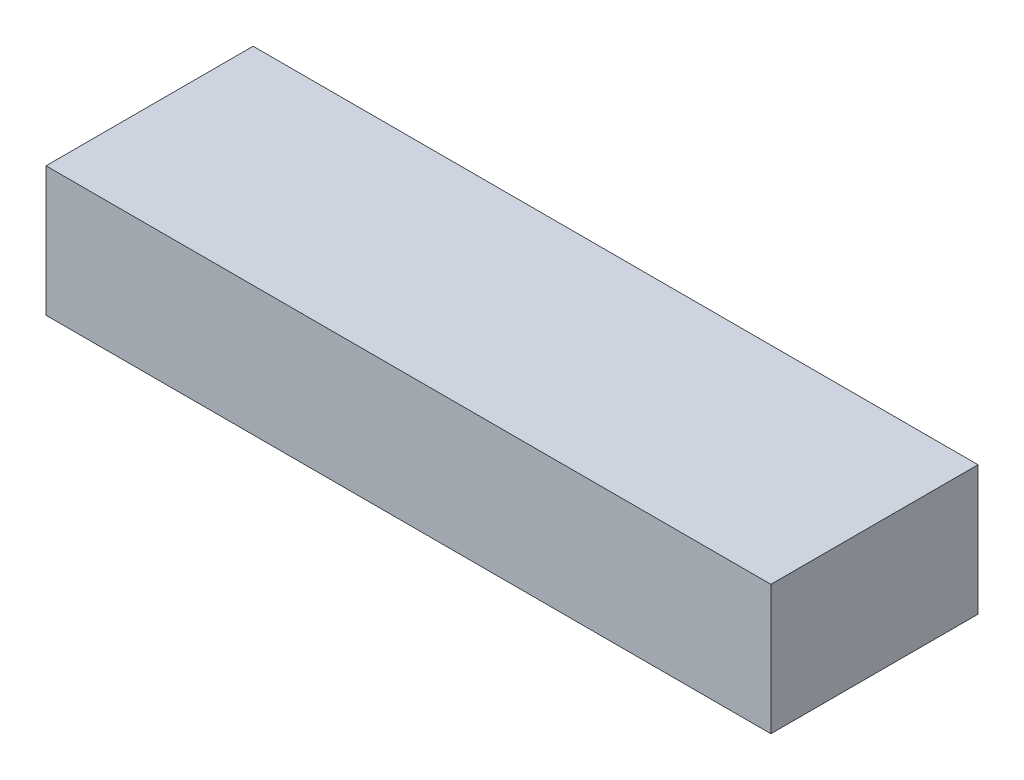
ISO-10303-21;
HEADER;
FILE_DESCRIPTION(('STEP AP214'),'2;1');
FILE_NAME('part.step','',(''),(''),'','','');
FILE_SCHEMA(('AUTOMOTIVE_DESIGN { 1 0 10303 214 1 1 1 1 }'));
ENDSEC;
DATA;
#1=APPLICATION_CONTEXT('core data for automotive mechanical design processes');
#2=APPLICATION_PROTOCOL_DEFINITION('international standard','automotive_design',2000,#1);
#3=PRODUCT_CONTEXT('',#1,'mechanical');
#4=PRODUCT('Part','Part','',(#3));
#5=PRODUCT_RELATED_PRODUCT_CATEGORY('part','',(#4));
#6=PRODUCT_DEFINITION_FORMATION('','',#4);
#7=PRODUCT_DEFINITION_CONTEXT('part definition',#1,'design');
#8=PRODUCT_DEFINITION('design','',#6,#7);
#9=PRODUCT_DEFINITION_SHAPE('','',#8);
#10=(LENGTH_UNIT() NAMED_UNIT(*) SI_UNIT(.MILLI.,.METRE.));
#11=(NAMED_UNIT(*) PLANE_ANGLE_UNIT() SI_UNIT($,.RADIAN.));
#12=(NAMED_UNIT(*) SI_UNIT($,.STERADIAN.) SOLID_ANGLE_UNIT());
#13=UNCERTAINTY_MEASURE_WITH_UNIT(LENGTH_MEASURE(1.E-05),#10,'distance_accuracy_value','');
#14=(GEOMETRIC_REPRESENTATION_CONTEXT(3) GLOBAL_UNCERTAINTY_ASSIGNED_CONTEXT((#13)) GLOBAL_UNIT_ASSIGNED_CONTEXT((#10,
#11,#12)) REPRESENTATION_CONTEXT('',''));
#15=CARTESIAN_POINT('',(0.,0.,0.));
#16=DIRECTION('',(0.,0.,1.));
#17=DIRECTION('',(1.,0.,0.));
#18=AXIS2_PLACEMENT_3D('',#15,#16,#17);
#19=CARTESIAN_POINT('',(70.,12.5,-20.));
#20=DIRECTION('',(0.,0.,1.));
#21=DIRECTION('',(0.,-1.,0.));
#22=AXIS2_PLACEMENT_3D('',#19,#20,#21);
#23=PLANE('',#22);
#24=DIRECTION('',(0.,1.,0.));
#25=VECTOR('',#24,1.);
#26=CARTESIAN_POINT('',(-70.,12.5,-20.));
#27=LINE('',#26,#25);
#28=CARTESIAN_POINT('',(-70.,-12.5,-20.));
#29=VERTEX_POINT('',#28);
#30=CARTESIAN_POINT('',(-70.,12.5,-20.));
#31=VERTEX_POINT('',#30);
#32=EDGE_CURVE('E100',#29,#31,#27,.T.);
#33=ORIENTED_EDGE('',*,*,#32,.T.);
#34=DIRECTION('',(-1.,0.,0.));
#35=VECTOR('',#34,1.);
#36=CARTESIAN_POINT('',(70.,12.5,-20.));
#37=LINE('',#36,#35);
#38=CARTESIAN_POINT('',(70.,12.5,-20.));
#39=VERTEX_POINT('',#38);
#40=EDGE_CURVE('E11',#39,#31,#37,.T.);
#41=ORIENTED_EDGE('',*,*,#40,.F.);
#42=DIRECTION('',(0.,1.,0.));
#43=VECTOR('',#42,1.);
#44=CARTESIAN_POINT('',(70.,12.5,-20.));
#45=LINE('',#44,#43);
#46=CARTESIAN_POINT('',(70.,-12.5,-20.));
#47=VERTEX_POINT('',#46);
#48=EDGE_CURVE('E88',#47,#39,#45,.T.);
#49=ORIENTED_EDGE('',*,*,#48,.F.);
#50=DIRECTION('',(-1.,0.,0.));
#51=VECTOR('',#50,1.);
#52=CARTESIAN_POINT('',(70.,-12.5,-20.));
#53=LINE('',#52,#51);
#54=EDGE_CURVE('E96',#47,#29,#53,.T.);
#55=ORIENTED_EDGE('',*,*,#54,.T.);
#56=EDGE_LOOP('',(#33,#41,#49,#55));
#57=FACE_BOUND('',#56,.T.);
#58=ADVANCED_FACE('F37',(#57),#23,.F.);
#59=CARTESIAN_POINT('',(70.,12.5,20.));
#60=DIRECTION('',(0.,-1.,0.));
#61=DIRECTION('',(0.,0.,-1.));
#62=AXIS2_PLACEMENT_3D('',#59,#60,#61);
#63=PLANE('',#62);
#64=DIRECTION('',(0.,0.,1.));
#65=VECTOR('',#64,1.);
#66=CARTESIAN_POINT('',(-70.,12.5,20.));
#67=LINE('',#66,#65);
#68=CARTESIAN_POINT('',(-70.,12.5,20.));
#69=VERTEX_POINT('',#68);
#70=EDGE_CURVE('E92',#31,#69,#67,.T.);
#71=ORIENTED_EDGE('',*,*,#70,.T.);
#72=DIRECTION('',(-1.,0.,0.));
#73=VECTOR('',#72,1.);
#74=CARTESIAN_POINT('',(70.,12.5,20.));
#75=LINE('',#74,#73);
#76=CARTESIAN_POINT('',(70.,12.5,20.));
#77=VERTEX_POINT('',#76);
#78=EDGE_CURVE('E45',#77,#69,#75,.T.);
#79=ORIENTED_EDGE('',*,*,#78,.F.);
#80=DIRECTION('',(0.,0.,1.));
#81=VECTOR('',#80,1.);
#82=CARTESIAN_POINT('',(70.,12.5,20.));
#83=LINE('',#82,#81);
#84=EDGE_CURVE('E83',#39,#77,#83,.T.);
#85=ORIENTED_EDGE('',*,*,#84,.F.);
#86=ORIENTED_EDGE('',*,*,#40,.T.);
#87=EDGE_LOOP('',(#71,#79,#85,#86));
#88=FACE_BOUND('',#87,.T.);
#89=ADVANCED_FACE('F91',(#88),#63,.F.);
#90=CARTESIAN_POINT('',(70.,12.5,20.));
#91=DIRECTION('',(0.,0.,-1.));
#92=DIRECTION('',(0.,1.,0.));
#93=AXIS2_PLACEMENT_3D('',#90,#91,#92);
#94=PLANE('',#93);
#95=DIRECTION('',(0.,-1.,0.));
#96=VECTOR('',#95,1.);
#97=CARTESIAN_POINT('',(-70.,12.5,20.));
#98=LINE('',#97,#96);
#99=CARTESIAN_POINT('',(-70.,-12.5,20.));
#100=VERTEX_POINT('',#99);
#101=EDGE_CURVE('E70',#69,#100,#98,.T.);
#102=ORIENTED_EDGE('',*,*,#101,.T.);
#103=DIRECTION('',(-1.,0.,0.));
#104=VECTOR('',#103,1.);
#105=CARTESIAN_POINT('',(70.,-12.5,20.));
#106=LINE('',#105,#104);
#107=CARTESIAN_POINT('',(70.,-12.5,20.));
#108=VERTEX_POINT('',#107);
#109=EDGE_CURVE('E93',#108,#100,#106,.T.);
#110=ORIENTED_EDGE('',*,*,#109,.F.);
#111=DIRECTION('',(0.,-1.,0.));
#112=VECTOR('',#111,1.);
#113=CARTESIAN_POINT('',(70.,12.5,20.));
#114=LINE('',#113,#112);
#115=EDGE_CURVE('E86',#77,#108,#114,.T.);
#116=ORIENTED_EDGE('',*,*,#115,.F.);
#117=ORIENTED_EDGE('',*,*,#78,.T.);
#118=EDGE_LOOP('',(#102,#110,#116,#117));
#119=FACE_BOUND('',#118,.T.);
#120=ADVANCED_FACE('F94',(#119),#94,.F.);
#121=CARTESIAN_POINT('',(70.,-12.5,20.));
#122=DIRECTION('',(0.,1.,0.));
#123=DIRECTION('',(0.,0.,1.));
#124=AXIS2_PLACEMENT_3D('',#121,#122,#123);
#125=PLANE('',#124);
#126=DIRECTION('',(0.,0.,-1.));
#127=VECTOR('',#126,1.);
#128=CARTESIAN_POINT('',(-70.,-12.5,20.));
#129=LINE('',#128,#127);
#130=EDGE_CURVE('E76',#100,#29,#129,.T.);
#131=ORIENTED_EDGE('',*,*,#130,.T.);
#132=ORIENTED_EDGE('',*,*,#54,.F.);
#133=DIRECTION('',(0.,0.,-1.));
#134=VECTOR('',#133,1.);
#135=CARTESIAN_POINT('',(70.,-12.5,20.));
#136=LINE('',#135,#134);
#137=EDGE_CURVE('E53',#108,#47,#136,.T.);
#138=ORIENTED_EDGE('',*,*,#137,.F.);
#139=ORIENTED_EDGE('',*,*,#109,.T.);
#140=EDGE_LOOP('',(#131,#132,#138,#139));
#141=FACE_BOUND('',#140,.T.);
#142=ADVANCED_FACE('F107',(#141),#125,.F.);
#143=CARTESIAN_POINT('',(70.,0.,0.));
#144=DIRECTION('',(1.,0.,0.));
#145=DIRECTION('',(0.,0.,-1.));
#146=AXIS2_PLACEMENT_3D('',#143,#144,#145);
#147=PLANE('',#146);
#148=ORIENTED_EDGE('',*,*,#48,.T.);
#149=ORIENTED_EDGE('',*,*,#84,.T.);
#150=ORIENTED_EDGE('',*,*,#115,.T.);
#151=ORIENTED_EDGE('',*,*,#137,.T.);
#152=EDGE_LOOP('',(#148,#149,#150,#151));
#153=FACE_BOUND('',#152,.T.);
#154=ADVANCED_FACE('F84',(#153),#147,.T.);
#155=CARTESIAN_POINT('',(-70.,0.,0.));
#156=DIRECTION('',(1.,0.,0.));
#157=DIRECTION('',(0.,0.,-1.));
#158=AXIS2_PLACEMENT_3D('',#155,#156,#157);
#159=PLANE('',#158);
#160=ORIENTED_EDGE('',*,*,#32,.F.);
#161=ORIENTED_EDGE('',*,*,#130,.F.);
#162=ORIENTED_EDGE('',*,*,#101,.F.);
#163=ORIENTED_EDGE('',*,*,#70,.F.);
#164=EDGE_LOOP('',(#160,#161,#162,#163));
#165=FACE_BOUND('',#164,.T.);
#166=ADVANCED_FACE('F110',(#165),#159,.F.);
#167=CLOSED_SHELL('',(#58,#89,#120,#142,#154,#166));
#168=MANIFOLD_SOLID_BREP('B2',#167);
#169=ADVANCED_BREP_SHAPE_REPRESENTATION('',(#18,#168),#14);
#170=SHAPE_DEFINITION_REPRESENTATION(#9,#169);
ENDSEC;
END-ISO-10303-21;
